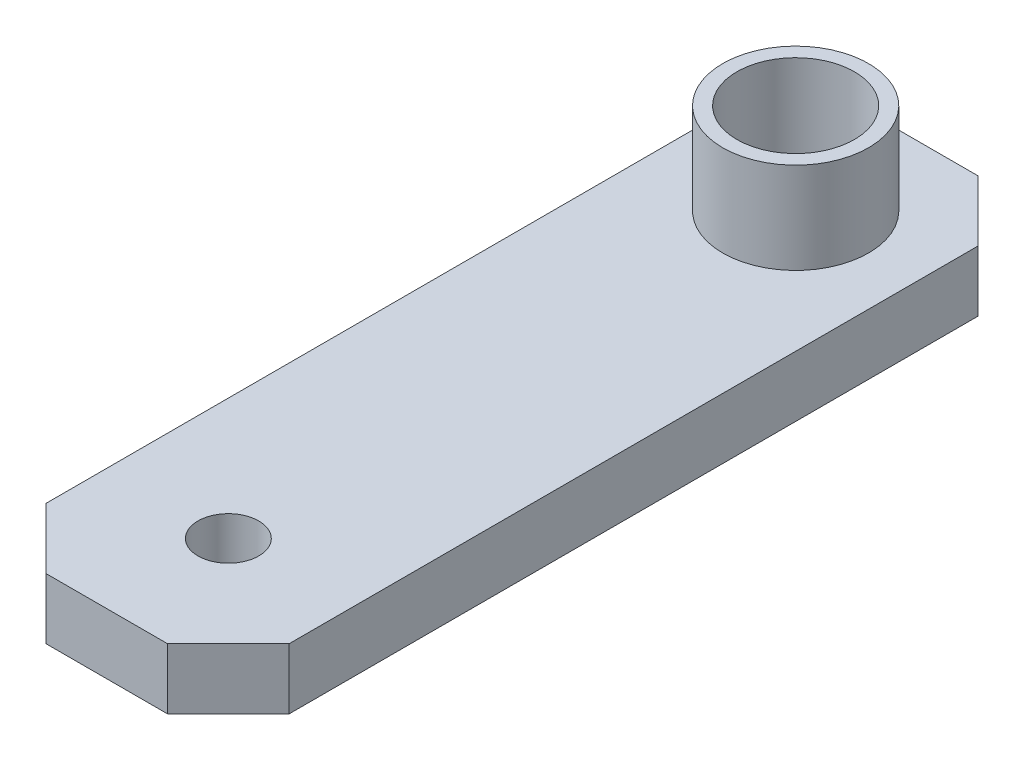
ISO-10303-21;
HEADER;
FILE_DESCRIPTION(('STEP AP214'),'2;1');
FILE_NAME('part.step','',(''),(''),'','','');
FILE_SCHEMA(('AUTOMOTIVE_DESIGN { 1 0 10303 214 1 1 1 1 }'));
ENDSEC;
DATA;
#1=APPLICATION_CONTEXT('core data for automotive mechanical design processes');
#2=APPLICATION_PROTOCOL_DEFINITION('international standard','automotive_design',2000,#1);
#3=PRODUCT_CONTEXT('',#1,'mechanical');
#4=PRODUCT('Part','Part','',(#3));
#5=PRODUCT_RELATED_PRODUCT_CATEGORY('part','',(#4));
#6=PRODUCT_DEFINITION_FORMATION('','',#4);
#7=PRODUCT_DEFINITION_CONTEXT('part definition',#1,'design');
#8=PRODUCT_DEFINITION('design','',#6,#7);
#9=PRODUCT_DEFINITION_SHAPE('','',#8);
#10=(LENGTH_UNIT() NAMED_UNIT(*) SI_UNIT(.MILLI.,.METRE.));
#11=(NAMED_UNIT(*) PLANE_ANGLE_UNIT() SI_UNIT($,.RADIAN.));
#12=(NAMED_UNIT(*) SI_UNIT($,.STERADIAN.) SOLID_ANGLE_UNIT());
#13=UNCERTAINTY_MEASURE_WITH_UNIT(LENGTH_MEASURE(1.E-05),#10,'distance_accuracy_value','');
#14=(GEOMETRIC_REPRESENTATION_CONTEXT(3) GLOBAL_UNCERTAINTY_ASSIGNED_CONTEXT((#13)) GLOBAL_UNIT_ASSIGNED_CONTEXT((#10,
#11,#12)) REPRESENTATION_CONTEXT('',''));
#15=CARTESIAN_POINT('',(0.,0.,0.));
#16=DIRECTION('',(0.,0.,1.));
#17=DIRECTION('',(1.,0.,0.));
#18=AXIS2_PLACEMENT_3D('',#15,#16,#17);
#19=CARTESIAN_POINT('',(0.,3.,0.));
#20=DIRECTION('',(0.,-1.,0.));
#21=DIRECTION('',(0.,0.,-1.));
#22=AXIS2_PLACEMENT_3D('',#19,#20,#21);
#23=PLANE('',#22);
#24=CARTESIAN_POINT('',(0.,3.,-14.));
#25=DIRECTION('',(0.,1.,0.));
#26=DIRECTION('',(0.,0.,1.));
#27=AXIS2_PLACEMENT_3D('',#24,#25,#26);
#28=CIRCLE('',#27,1.5);
#29=CARTESIAN_POINT('',(0.,3.,-12.5));
#30=VERTEX_POINT('',#29);
#31=EDGE_CURVE('E142',#30,#30,#28,.T.);
#32=ORIENTED_EDGE('',*,*,#31,.F.);
#33=EDGE_LOOP('',(#32));
#34=FACE_BOUND('',#33,.T.);
#35=CARTESIAN_POINT('',(0.,3.,-14.));
#36=DIRECTION('',(0.,1.,0.));
#37=DIRECTION('',(0.,0.,1.));
#38=AXIS2_PLACEMENT_3D('',#35,#36,#37);
#39=CIRCLE('',#38,2.9);
#40=CARTESIAN_POINT('',(0.,3.,-11.1));
#41=VERTEX_POINT('',#40);
#42=EDGE_CURVE('E205',#41,#41,#39,.T.);
#43=ORIENTED_EDGE('',*,*,#42,.T.);
#44=EDGE_LOOP('',(#43));
#45=FACE_BOUND('',#44,.T.);
#46=ADVANCED_FACE('F38',(#34,#45),#23,.F.);
#47=CARTESIAN_POINT('',(0.,3.,-14.));
#48=DIRECTION('',(0.,1.,0.));
#49=DIRECTION('',(0.,0.,1.));
#50=AXIS2_PLACEMENT_3D('',#47,#48,#49);
#51=CIRCLE('',#50,3.6);
#52=CARTESIAN_POINT('',(0.,3.,-10.4));
#53=VERTEX_POINT('',#52);
#54=EDGE_CURVE('E11',#53,#53,#51,.T.);
#55=ORIENTED_EDGE('',*,*,#54,.F.);
#56=EDGE_LOOP('',(#55));
#57=FACE_BOUND('',#56,.T.);
#58=DIRECTION('',(-1.,0.,0.));
#59=VECTOR('',#58,1.);
#60=CARTESIAN_POINT('',(-3.,3.,-20.));
#61=LINE('',#60,#59);
#62=CARTESIAN_POINT('',(3.,3.,-20.));
#63=VERTEX_POINT('',#62);
#64=CARTESIAN_POINT('',(-3.,3.,-20.));
#65=VERTEX_POINT('',#64);
#66=EDGE_CURVE('E153',#63,#65,#61,.T.);
#67=ORIENTED_EDGE('',*,*,#66,.T.);
#68=DIRECTION('',(-0.707106781186548,0.,0.707106781186548));
#69=VECTOR('',#68,1.);
#70=CARTESIAN_POINT('',(-6.,3.,-17.));
#71=LINE('',#70,#69);
#72=CARTESIAN_POINT('',(-6.,3.,-17.));
#73=VERTEX_POINT('',#72);
#74=EDGE_CURVE('E100',#65,#73,#71,.T.);
#75=ORIENTED_EDGE('',*,*,#74,.T.);
#76=DIRECTION('',(0.,0.,1.));
#77=VECTOR('',#76,1.);
#78=CARTESIAN_POINT('',(-6.,3.,-17.));
#79=LINE('',#78,#77);
#80=CARTESIAN_POINT('',(-6.,3.,17.));
#81=VERTEX_POINT('',#80);
#82=EDGE_CURVE('E184',#73,#81,#79,.T.);
#83=ORIENTED_EDGE('',*,*,#82,.T.);
#84=DIRECTION('',(0.707106781186548,0.,0.707106781186547));
#85=VECTOR('',#84,1.);
#86=CARTESIAN_POINT('',(-6.,3.,17.));
#87=LINE('',#86,#85);
#88=CARTESIAN_POINT('',(-3.,3.,20.));
#89=VERTEX_POINT('',#88);
#90=EDGE_CURVE('E183',#81,#89,#87,.T.);
#91=ORIENTED_EDGE('',*,*,#90,.T.);
#92=DIRECTION('',(1.,0.,0.));
#93=VECTOR('',#92,1.);
#94=CARTESIAN_POINT('',(-3.,3.,20.));
#95=LINE('',#94,#93);
#96=CARTESIAN_POINT('',(3.,3.,20.));
#97=VERTEX_POINT('',#96);
#98=EDGE_CURVE('E120',#89,#97,#95,.T.);
#99=ORIENTED_EDGE('',*,*,#98,.T.);
#100=DIRECTION('',(0.707106781186548,0.,-0.707106781186548));
#101=VECTOR('',#100,1.);
#102=CARTESIAN_POINT('',(3.,3.,20.));
#103=LINE('',#102,#101);
#104=CARTESIAN_POINT('',(6.,3.,17.));
#105=VERTEX_POINT('',#104);
#106=EDGE_CURVE('E113',#97,#105,#103,.T.);
#107=ORIENTED_EDGE('',*,*,#106,.T.);
#108=DIRECTION('',(0.,0.,-1.));
#109=VECTOR('',#108,1.);
#110=CARTESIAN_POINT('',(6.,3.,-17.));
#111=LINE('',#110,#109);
#112=CARTESIAN_POINT('',(6.,3.,-17.));
#113=VERTEX_POINT('',#112);
#114=EDGE_CURVE('E118',#105,#113,#111,.T.);
#115=ORIENTED_EDGE('',*,*,#114,.T.);
#116=DIRECTION('',(-0.707106781186548,0.,-0.707106781186548));
#117=VECTOR('',#116,1.);
#118=CARTESIAN_POINT('',(3.,3.,-20.));
#119=LINE('',#118,#117);
#120=EDGE_CURVE('E56',#113,#63,#119,.T.);
#121=ORIENTED_EDGE('',*,*,#120,.T.);
#122=EDGE_LOOP('',(#67,#75,#83,#91,#99,#107,#115,#121));
#123=FACE_BOUND('',#122,.T.);
#124=CARTESIAN_POINT('',(0.,3.,14.));
#125=DIRECTION('',(0.,1.,0.));
#126=DIRECTION('',(0.,0.,1.));
#127=AXIS2_PLACEMENT_3D('',#124,#125,#126);
#128=CIRCLE('',#127,1.5);
#129=CARTESIAN_POINT('',(0.,3.,15.5));
#130=VERTEX_POINT('',#129);
#131=EDGE_CURVE('E193',#130,#130,#128,.T.);
#132=ORIENTED_EDGE('',*,*,#131,.F.);
#133=EDGE_LOOP('',(#132));
#134=FACE_BOUND('',#133,.T.);
#135=ADVANCED_FACE('F115',(#57,#123,#134),#23,.F.);
#136=CARTESIAN_POINT('',(0.,0.,0.));
#137=DIRECTION('',(0.,-1.,0.));
#138=DIRECTION('',(0.,0.,-1.));
#139=AXIS2_PLACEMENT_3D('',#136,#137,#138);
#140=PLANE('',#139);
#141=CARTESIAN_POINT('',(0.,0.,-14.));
#142=DIRECTION('',(0.,1.,0.));
#143=DIRECTION('',(0.,0.,1.));
#144=AXIS2_PLACEMENT_3D('',#141,#142,#143);
#145=CIRCLE('',#144,1.5);
#146=CARTESIAN_POINT('',(0.,0.,-12.5));
#147=VERTEX_POINT('',#146);
#148=EDGE_CURVE('E190',#147,#147,#145,.T.);
#149=ORIENTED_EDGE('',*,*,#148,.T.);
#150=EDGE_LOOP('',(#149));
#151=FACE_BOUND('',#150,.T.);
#152=DIRECTION('',(-1.,0.,0.));
#153=VECTOR('',#152,1.);
#154=CARTESIAN_POINT('',(-3.,0.,-20.));
#155=LINE('',#154,#153);
#156=CARTESIAN_POINT('',(3.,0.,-20.));
#157=VERTEX_POINT('',#156);
#158=CARTESIAN_POINT('',(-3.,0.,-20.));
#159=VERTEX_POINT('',#158);
#160=EDGE_CURVE('E138',#157,#159,#155,.T.);
#161=ORIENTED_EDGE('',*,*,#160,.F.);
#162=DIRECTION('',(-0.707106781186548,0.,-0.707106781186548));
#163=VECTOR('',#162,1.);
#164=CARTESIAN_POINT('',(3.,0.,-20.));
#165=LINE('',#164,#163);
#166=CARTESIAN_POINT('',(6.,0.,-17.));
#167=VERTEX_POINT('',#166);
#168=EDGE_CURVE('E91',#167,#157,#165,.T.);
#169=ORIENTED_EDGE('',*,*,#168,.F.);
#170=DIRECTION('',(0.,0.,-1.));
#171=VECTOR('',#170,1.);
#172=CARTESIAN_POINT('',(6.,0.,-17.));
#173=LINE('',#172,#171);
#174=CARTESIAN_POINT('',(6.,0.,17.));
#175=VERTEX_POINT('',#174);
#176=EDGE_CURVE('E85',#175,#167,#173,.T.);
#177=ORIENTED_EDGE('',*,*,#176,.F.);
#178=DIRECTION('',(0.707106781186548,0.,-0.707106781186548));
#179=VECTOR('',#178,1.);
#180=CARTESIAN_POINT('',(3.,0.,20.));
#181=LINE('',#180,#179);
#182=CARTESIAN_POINT('',(3.,0.,20.));
#183=VERTEX_POINT('',#182);
#184=EDGE_CURVE('E128',#183,#175,#181,.T.);
#185=ORIENTED_EDGE('',*,*,#184,.F.);
#186=DIRECTION('',(1.,0.,0.));
#187=VECTOR('',#186,1.);
#188=CARTESIAN_POINT('',(-3.,0.,20.));
#189=LINE('',#188,#187);
#190=CARTESIAN_POINT('',(-3.,0.,20.));
#191=VERTEX_POINT('',#190);
#192=EDGE_CURVE('E148',#191,#183,#189,.T.);
#193=ORIENTED_EDGE('',*,*,#192,.F.);
#194=DIRECTION('',(0.707106781186548,0.,0.707106781186547));
#195=VECTOR('',#194,1.);
#196=CARTESIAN_POINT('',(-6.,0.,17.));
#197=LINE('',#196,#195);
#198=CARTESIAN_POINT('',(-6.,0.,17.));
#199=VERTEX_POINT('',#198);
#200=EDGE_CURVE('E146',#199,#191,#197,.T.);
#201=ORIENTED_EDGE('',*,*,#200,.F.);
#202=DIRECTION('',(0.,0.,1.));
#203=VECTOR('',#202,1.);
#204=CARTESIAN_POINT('',(-6.,0.,-17.));
#205=LINE('',#204,#203);
#206=CARTESIAN_POINT('',(-6.,0.,-17.));
#207=VERTEX_POINT('',#206);
#208=EDGE_CURVE('E144',#207,#199,#205,.T.);
#209=ORIENTED_EDGE('',*,*,#208,.F.);
#210=DIRECTION('',(-0.707106781186548,0.,0.707106781186548));
#211=VECTOR('',#210,1.);
#212=CARTESIAN_POINT('',(-6.,0.,-17.));
#213=LINE('',#212,#211);
#214=EDGE_CURVE('E141',#159,#207,#213,.T.);
#215=ORIENTED_EDGE('',*,*,#214,.F.);
#216=EDGE_LOOP('',(#161,#169,#177,#185,#193,#201,#209,#215));
#217=FACE_BOUND('',#216,.T.);
#218=CARTESIAN_POINT('',(0.,0.,14.));
#219=DIRECTION('',(0.,1.,0.));
#220=DIRECTION('',(0.,0.,1.));
#221=AXIS2_PLACEMENT_3D('',#218,#219,#220);
#222=CIRCLE('',#221,1.5);
#223=CARTESIAN_POINT('',(0.,0.,15.5));
#224=VERTEX_POINT('',#223);
#225=EDGE_CURVE('E196',#224,#224,#222,.T.);
#226=ORIENTED_EDGE('',*,*,#225,.T.);
#227=EDGE_LOOP('',(#226));
#228=FACE_BOUND('',#227,.T.);
#229=ADVANCED_FACE('F173',(#151,#217,#228),#140,.T.);
#230=CARTESIAN_POINT('',(-3.,3.,-20.));
#231=DIRECTION('',(0.,0.,1.));
#232=DIRECTION('',(1.,0.,0.));
#233=AXIS2_PLACEMENT_3D('',#230,#231,#232);
#234=PLANE('',#233);
#235=ORIENTED_EDGE('',*,*,#160,.T.);
#236=DIRECTION('',(0.,-1.,0.));
#237=VECTOR('',#236,1.);
#238=CARTESIAN_POINT('',(-3.,3.,-20.));
#239=LINE('',#238,#237);
#240=EDGE_CURVE('E42',#65,#159,#239,.T.);
#241=ORIENTED_EDGE('',*,*,#240,.F.);
#242=ORIENTED_EDGE('',*,*,#66,.F.);
#243=DIRECTION('',(0.,-1.,0.));
#244=VECTOR('',#243,1.);
#245=CARTESIAN_POINT('',(3.,3.,-20.));
#246=LINE('',#245,#244);
#247=EDGE_CURVE('E134',#63,#157,#246,.T.);
#248=ORIENTED_EDGE('',*,*,#247,.T.);
#249=EDGE_LOOP('',(#235,#241,#242,#248));
#250=FACE_BOUND('',#249,.T.);
#251=ADVANCED_FACE('F40',(#250),#234,.F.);
#252=CARTESIAN_POINT('',(-6.,3.,-17.));
#253=DIRECTION('',(0.707106781186547,0.,0.707106781186547));
#254=DIRECTION('',(0.707106781186548,0.,-0.707106781186548));
#255=AXIS2_PLACEMENT_3D('',#252,#253,#254);
#256=PLANE('',#255);
#257=ORIENTED_EDGE('',*,*,#214,.T.);
#258=DIRECTION('',(0.,-1.,0.));
#259=VECTOR('',#258,1.);
#260=CARTESIAN_POINT('',(-6.,3.,-17.));
#261=LINE('',#260,#259);
#262=EDGE_CURVE('E162',#73,#207,#261,.T.);
#263=ORIENTED_EDGE('',*,*,#262,.F.);
#264=ORIENTED_EDGE('',*,*,#74,.F.);
#265=ORIENTED_EDGE('',*,*,#240,.T.);
#266=EDGE_LOOP('',(#257,#263,#264,#265));
#267=FACE_BOUND('',#266,.T.);
#268=ADVANCED_FACE('F168',(#267),#256,.F.);
#269=CARTESIAN_POINT('',(-6.,3.,-17.));
#270=DIRECTION('',(1.,0.,0.));
#271=DIRECTION('',(0.,0.,-1.));
#272=AXIS2_PLACEMENT_3D('',#269,#270,#271);
#273=PLANE('',#272);
#274=ORIENTED_EDGE('',*,*,#208,.T.);
#275=DIRECTION('',(0.,-1.,0.));
#276=VECTOR('',#275,1.);
#277=CARTESIAN_POINT('',(-6.,3.,17.));
#278=LINE('',#277,#276);
#279=EDGE_CURVE('E160',#81,#199,#278,.T.);
#280=ORIENTED_EDGE('',*,*,#279,.F.);
#281=ORIENTED_EDGE('',*,*,#82,.F.);
#282=ORIENTED_EDGE('',*,*,#262,.T.);
#283=EDGE_LOOP('',(#274,#280,#281,#282));
#284=FACE_BOUND('',#283,.T.);
#285=ADVANCED_FACE('F178',(#284),#273,.F.);
#286=CARTESIAN_POINT('',(-6.,3.,17.));
#287=DIRECTION('',(0.707106781186547,0.,-0.707106781186548));
#288=DIRECTION('',(-0.707106781186548,0.,-0.707106781186547));
#289=AXIS2_PLACEMENT_3D('',#286,#287,#288);
#290=PLANE('',#289);
#291=ORIENTED_EDGE('',*,*,#200,.T.);
#292=DIRECTION('',(0.,-1.,0.));
#293=VECTOR('',#292,1.);
#294=CARTESIAN_POINT('',(-3.,3.,20.));
#295=LINE('',#294,#293);
#296=EDGE_CURVE('E157',#89,#191,#295,.T.);
#297=ORIENTED_EDGE('',*,*,#296,.F.);
#298=ORIENTED_EDGE('',*,*,#90,.F.);
#299=ORIENTED_EDGE('',*,*,#279,.T.);
#300=EDGE_LOOP('',(#291,#297,#298,#299));
#301=FACE_BOUND('',#300,.T.);
#302=ADVANCED_FACE('F181',(#301),#290,.F.);
#303=CARTESIAN_POINT('',(-3.,3.,20.));
#304=DIRECTION('',(0.,0.,-1.));
#305=DIRECTION('',(-1.,0.,0.));
#306=AXIS2_PLACEMENT_3D('',#303,#304,#305);
#307=PLANE('',#306);
#308=ORIENTED_EDGE('',*,*,#192,.T.);
#309=DIRECTION('',(0.,-1.,0.));
#310=VECTOR('',#309,1.);
#311=CARTESIAN_POINT('',(3.,3.,20.));
#312=LINE('',#311,#310);
#313=EDGE_CURVE('E129',#97,#183,#312,.T.);
#314=ORIENTED_EDGE('',*,*,#313,.F.);
#315=ORIENTED_EDGE('',*,*,#98,.F.);
#316=ORIENTED_EDGE('',*,*,#296,.T.);
#317=EDGE_LOOP('',(#308,#314,#315,#316));
#318=FACE_BOUND('',#317,.T.);
#319=ADVANCED_FACE('F251',(#318),#307,.F.);
#320=CARTESIAN_POINT('',(3.,3.,20.));
#321=DIRECTION('',(-0.707106781186547,0.,-0.707106781186547));
#322=DIRECTION('',(-0.707106781186548,0.,0.707106781186548));
#323=AXIS2_PLACEMENT_3D('',#320,#321,#322);
#324=PLANE('',#323);
#325=ORIENTED_EDGE('',*,*,#184,.T.);
#326=DIRECTION('',(0.,-1.,0.));
#327=VECTOR('',#326,1.);
#328=CARTESIAN_POINT('',(6.,3.,17.));
#329=LINE('',#328,#327);
#330=EDGE_CURVE('E125',#105,#175,#329,.T.);
#331=ORIENTED_EDGE('',*,*,#330,.F.);
#332=ORIENTED_EDGE('',*,*,#106,.F.);
#333=ORIENTED_EDGE('',*,*,#313,.T.);
#334=EDGE_LOOP('',(#325,#331,#332,#333));
#335=FACE_BOUND('',#334,.T.);
#336=ADVANCED_FACE('F126',(#335),#324,.F.);
#337=CARTESIAN_POINT('',(6.,3.,-17.));
#338=DIRECTION('',(-1.,0.,0.));
#339=DIRECTION('',(0.,0.,1.));
#340=AXIS2_PLACEMENT_3D('',#337,#338,#339);
#341=PLANE('',#340);
#342=ORIENTED_EDGE('',*,*,#176,.T.);
#343=DIRECTION('',(0.,-1.,0.));
#344=VECTOR('',#343,1.);
#345=CARTESIAN_POINT('',(6.,3.,-17.));
#346=LINE('',#345,#344);
#347=EDGE_CURVE('E130',#113,#167,#346,.T.);
#348=ORIENTED_EDGE('',*,*,#347,.F.);
#349=ORIENTED_EDGE('',*,*,#114,.F.);
#350=ORIENTED_EDGE('',*,*,#330,.T.);
#351=EDGE_LOOP('',(#342,#348,#349,#350));
#352=FACE_BOUND('',#351,.T.);
#353=ADVANCED_FACE('F132',(#352),#341,.F.);
#354=CARTESIAN_POINT('',(3.,3.,-20.));
#355=DIRECTION('',(-0.707106781186547,0.,0.707106781186547));
#356=DIRECTION('',(0.707106781186548,0.,0.707106781186548));
#357=AXIS2_PLACEMENT_3D('',#354,#355,#356);
#358=PLANE('',#357);
#359=ORIENTED_EDGE('',*,*,#168,.T.);
#360=ORIENTED_EDGE('',*,*,#247,.F.);
#361=ORIENTED_EDGE('',*,*,#120,.F.);
#362=ORIENTED_EDGE('',*,*,#347,.T.);
#363=EDGE_LOOP('',(#359,#360,#361,#362));
#364=FACE_BOUND('',#363,.T.);
#365=ADVANCED_FACE('F244',(#364),#358,.F.);
#366=CARTESIAN_POINT('',(0.,3.,-14.));
#367=DIRECTION('',(0.,-1.,0.));
#368=DIRECTION('',(0.,0.,-1.));
#369=AXIS2_PLACEMENT_3D('',#366,#367,#368);
#370=CYLINDRICAL_SURFACE('',#369,1.5);
#371=ORIENTED_EDGE('',*,*,#31,.T.);
#372=EDGE_LOOP('',(#371));
#373=FACE_BOUND('',#372,.T.);
#374=ORIENTED_EDGE('',*,*,#148,.F.);
#375=EDGE_LOOP('',(#374));
#376=FACE_BOUND('',#375,.T.);
#377=ADVANCED_FACE('F227',(#373,#376),#370,.F.);
#378=CARTESIAN_POINT('',(0.,3.,14.));
#379=DIRECTION('',(0.,-1.,0.));
#380=DIRECTION('',(0.,0.,-1.));
#381=AXIS2_PLACEMENT_3D('',#378,#379,#380);
#382=CYLINDRICAL_SURFACE('',#381,1.5);
#383=ORIENTED_EDGE('',*,*,#131,.T.);
#384=EDGE_LOOP('',(#383));
#385=FACE_BOUND('',#384,.T.);
#386=ORIENTED_EDGE('',*,*,#225,.F.);
#387=EDGE_LOOP('',(#386));
#388=FACE_BOUND('',#387,.T.);
#389=ADVANCED_FACE('F217',(#385,#388),#382,.F.);
#390=CARTESIAN_POINT('',(0.,7.5,-14.));
#391=DIRECTION('',(0.,1.,0.));
#392=DIRECTION('',(0.,0.,1.));
#393=AXIS2_PLACEMENT_3D('',#390,#391,#392);
#394=PLANE('',#393);
#395=CARTESIAN_POINT('',(0.,7.5,-14.));
#396=DIRECTION('',(0.,1.,0.));
#397=DIRECTION('',(0.,0.,1.));
#398=AXIS2_PLACEMENT_3D('',#395,#396,#397);
#399=CIRCLE('',#398,3.6);
#400=CARTESIAN_POINT('',(0.,7.5,-10.4));
#401=VERTEX_POINT('',#400);
#402=EDGE_CURVE('E199',#401,#401,#399,.T.);
#403=ORIENTED_EDGE('',*,*,#402,.T.);
#404=EDGE_LOOP('',(#403));
#405=FACE_BOUND('',#404,.T.);
#406=CARTESIAN_POINT('',(0.,7.5,-14.));
#407=DIRECTION('',(0.,1.,0.));
#408=DIRECTION('',(0.,0.,1.));
#409=AXIS2_PLACEMENT_3D('',#406,#407,#408);
#410=CIRCLE('',#409,2.9);
#411=CARTESIAN_POINT('',(0.,7.5,-11.1));
#412=VERTEX_POINT('',#411);
#413=EDGE_CURVE('E204',#412,#412,#410,.T.);
#414=ORIENTED_EDGE('',*,*,#413,.F.);
#415=EDGE_LOOP('',(#414));
#416=FACE_BOUND('',#415,.T.);
#417=ADVANCED_FACE('F214',(#405,#416),#394,.T.);
#418=CARTESIAN_POINT('',(0.,7.5,-14.));
#419=DIRECTION('',(0.,-1.,0.));
#420=DIRECTION('',(0.,0.,-1.));
#421=AXIS2_PLACEMENT_3D('',#418,#419,#420);
#422=CYLINDRICAL_SURFACE('',#421,3.6);
#423=ORIENTED_EDGE('',*,*,#402,.F.);
#424=EDGE_LOOP('',(#423));
#425=FACE_BOUND('',#424,.T.);
#426=ORIENTED_EDGE('',*,*,#54,.T.);
#427=EDGE_LOOP('',(#426));
#428=FACE_BOUND('',#427,.T.);
#429=ADVANCED_FACE('F216',(#425,#428),#422,.T.);
#430=CARTESIAN_POINT('',(0.,7.5,-14.));
#431=DIRECTION('',(0.,-1.,0.));
#432=DIRECTION('',(0.,0.,-1.));
#433=AXIS2_PLACEMENT_3D('',#430,#431,#432);
#434=CYLINDRICAL_SURFACE('',#433,2.9);
#435=ORIENTED_EDGE('',*,*,#413,.T.);
#436=EDGE_LOOP('',(#435));
#437=FACE_BOUND('',#436,.T.);
#438=ORIENTED_EDGE('',*,*,#42,.F.);
#439=EDGE_LOOP('',(#438));
#440=FACE_BOUND('',#439,.T.);
#441=ADVANCED_FACE('F211',(#437,#440),#434,.F.);
#442=CLOSED_SHELL('',(#46,#135,#229,#251,#268,#285,#302,#319,#336,#353,#365,#377,#389,#417,#429,#441));
#443=MANIFOLD_SOLID_BREP('B2',#442);
#444=ADVANCED_BREP_SHAPE_REPRESENTATION('',(#18,#443),#14);
#445=SHAPE_DEFINITION_REPRESENTATION(#9,#444);
ENDSEC;
END-ISO-10303-21;
